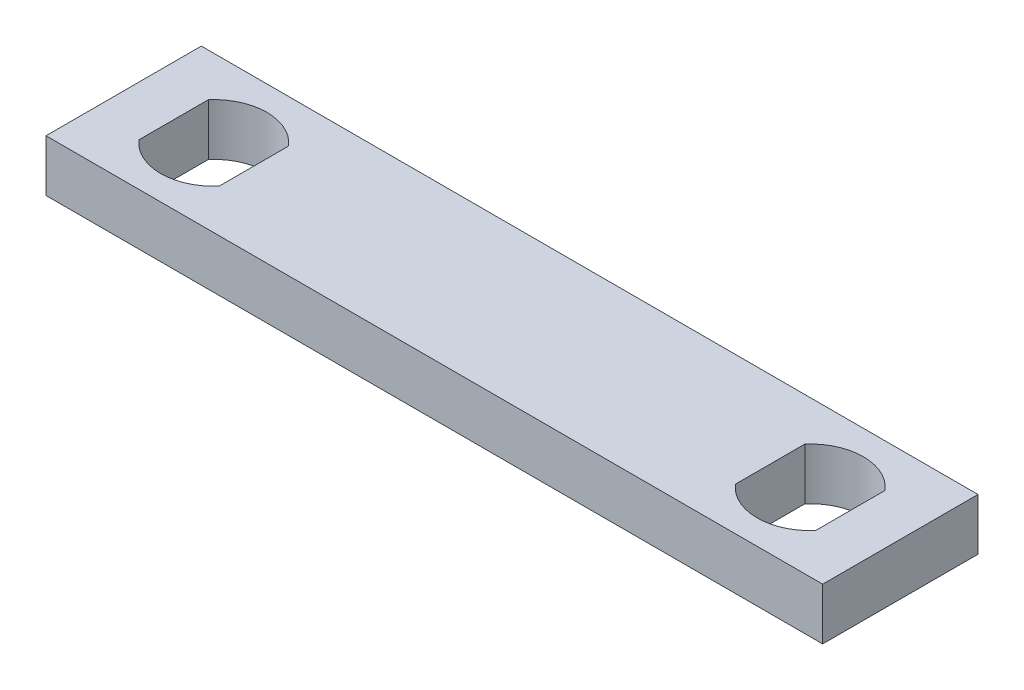
ISO-10303-21;
HEADER;
FILE_DESCRIPTION(('STEP AP214'),'2;1');
FILE_NAME('part.step','',(''),(''),'','','');
FILE_SCHEMA(('AUTOMOTIVE_DESIGN { 1 0 10303 214 1 1 1 1 }'));
ENDSEC;
DATA;
#1=APPLICATION_CONTEXT('core data for automotive mechanical design processes');
#2=APPLICATION_PROTOCOL_DEFINITION('international standard','automotive_design',2000,#1);
#3=PRODUCT_CONTEXT('',#1,'mechanical');
#4=PRODUCT('Part','Part','',(#3));
#5=PRODUCT_RELATED_PRODUCT_CATEGORY('part','',(#4));
#6=PRODUCT_DEFINITION_FORMATION('','',#4);
#7=PRODUCT_DEFINITION_CONTEXT('part definition',#1,'design');
#8=PRODUCT_DEFINITION('design','',#6,#7);
#9=PRODUCT_DEFINITION_SHAPE('','',#8);
#10=(LENGTH_UNIT() NAMED_UNIT(*) SI_UNIT(.MILLI.,.METRE.));
#11=(NAMED_UNIT(*) PLANE_ANGLE_UNIT() SI_UNIT($,.RADIAN.));
#12=(NAMED_UNIT(*) SI_UNIT($,.STERADIAN.) SOLID_ANGLE_UNIT());
#13=UNCERTAINTY_MEASURE_WITH_UNIT(LENGTH_MEASURE(1.E-05),#10,'distance_accuracy_value','');
#14=(GEOMETRIC_REPRESENTATION_CONTEXT(3) GLOBAL_UNCERTAINTY_ASSIGNED_CONTEXT((#13)) GLOBAL_UNIT_ASSIGNED_CONTEXT((#10,
#11,#12)) REPRESENTATION_CONTEXT('',''));
#15=CARTESIAN_POINT('',(0.,0.,0.));
#16=DIRECTION('',(0.,0.,1.));
#17=DIRECTION('',(1.,0.,0.));
#18=AXIS2_PLACEMENT_3D('',#15,#16,#17);
#19=CARTESIAN_POINT('',(0.,5.,0.));
#20=DIRECTION('',(0.,1.,0.));
#21=DIRECTION('',(0.,0.,1.));
#22=AXIS2_PLACEMENT_3D('',#19,#20,#21);
#23=PLANE('',#22);
#24=CARTESIAN_POINT('',(-57.6,5.,0.));
#25=DIRECTION('',(0.,1.,0.));
#26=DIRECTION('',(0.,0.,1.));
#27=AXIS2_PLACEMENT_3D('',#24,#25,#26);
#28=CIRCLE('',#27,10.25);
#29=CARTESIAN_POINT('',(-49.85,5.,-6.70820393249937));
#30=VERTEX_POINT('',#29);
#31=CARTESIAN_POINT('',(-65.35,5.,-6.70820393249937));
#32=VERTEX_POINT('',#31);
#33=EDGE_CURVE('E170',#30,#32,#28,.T.);
#34=ORIENTED_EDGE('',*,*,#33,.F.);
#35=DIRECTION('',(0.,0.,-1.));
#36=VECTOR('',#35,1.);
#37=CARTESIAN_POINT('',(-49.85,5.,-6.70820393249937));
#38=LINE('',#37,#36);
#39=CARTESIAN_POINT('',(-49.85,5.,6.70820393249936));
#40=VERTEX_POINT('',#39);
#41=EDGE_CURVE('E181',#40,#30,#38,.T.);
#42=ORIENTED_EDGE('',*,*,#41,.F.);
#43=CARTESIAN_POINT('',(-57.6,5.,0.));
#44=DIRECTION('',(0.,1.,0.));
#45=DIRECTION('',(0.,0.,1.));
#46=AXIS2_PLACEMENT_3D('',#43,#44,#45);
#47=CIRCLE('',#46,10.25);
#48=CARTESIAN_POINT('',(-65.35,5.,6.70820393249937));
#49=VERTEX_POINT('',#48);
#50=EDGE_CURVE('E200',#49,#40,#47,.T.);
#51=ORIENTED_EDGE('',*,*,#50,.F.);
#52=DIRECTION('',(0.,0.,1.));
#53=VECTOR('',#52,1.);
#54=CARTESIAN_POINT('',(-65.35,5.,-6.70820393249937));
#55=LINE('',#54,#53);
#56=EDGE_CURVE('E196',#32,#49,#55,.T.);
#57=ORIENTED_EDGE('',*,*,#56,.F.);
#58=EDGE_LOOP('',(#34,#42,#51,#57));
#59=FACE_BOUND('',#58,.T.);
#60=DIRECTION('',(0.,0.,-1.));
#61=VECTOR('',#60,1.);
#62=CARTESIAN_POINT('',(75.,5.,-15.));
#63=LINE('',#62,#61);
#64=CARTESIAN_POINT('',(75.,5.,15.));
#65=VERTEX_POINT('',#64);
#66=CARTESIAN_POINT('',(75.,5.,-15.));
#67=VERTEX_POINT('',#66);
#68=EDGE_CURVE('E220',#65,#67,#63,.T.);
#69=ORIENTED_EDGE('',*,*,#68,.T.);
#70=DIRECTION('',(-1.,0.,0.));
#71=VECTOR('',#70,1.);
#72=CARTESIAN_POINT('',(-75.,5.,-15.));
#73=LINE('',#72,#71);
#74=CARTESIAN_POINT('',(-75.,5.,-15.));
#75=VERTEX_POINT('',#74);
#76=EDGE_CURVE('E224',#67,#75,#73,.T.);
#77=ORIENTED_EDGE('',*,*,#76,.T.);
#78=DIRECTION('',(0.,0.,1.));
#79=VECTOR('',#78,1.);
#80=CARTESIAN_POINT('',(-75.,5.,-15.));
#81=LINE('',#80,#79);
#82=CARTESIAN_POINT('',(-75.,5.,15.));
#83=VERTEX_POINT('',#82);
#84=EDGE_CURVE('E228',#75,#83,#81,.T.);
#85=ORIENTED_EDGE('',*,*,#84,.T.);
#86=DIRECTION('',(1.,0.,0.));
#87=VECTOR('',#86,1.);
#88=CARTESIAN_POINT('',(-75.,5.,15.));
#89=LINE('',#88,#87);
#90=EDGE_CURVE('E231',#83,#65,#89,.T.);
#91=ORIENTED_EDGE('',*,*,#90,.T.);
#92=EDGE_LOOP('',(#69,#77,#85,#91));
#93=FACE_BOUND('',#92,.T.);
#94=DIRECTION('',(0.,0.,-1.));
#95=VECTOR('',#94,1.);
#96=CARTESIAN_POINT('',(49.85,5.,-6.70820393249937));
#97=LINE('',#96,#95);
#98=CARTESIAN_POINT('',(49.85,5.,6.70820393249936));
#99=VERTEX_POINT('',#98);
#100=CARTESIAN_POINT('',(49.85,5.,-6.70820393249937));
#101=VERTEX_POINT('',#100);
#102=EDGE_CURVE('E161',#99,#101,#97,.T.);
#103=ORIENTED_EDGE('',*,*,#102,.T.);
#104=CARTESIAN_POINT('',(57.6,5.,0.));
#105=DIRECTION('',(0.,-1.,0.));
#106=DIRECTION('',(0.,0.,1.));
#107=AXIS2_PLACEMENT_3D('',#104,#105,#106);
#108=CIRCLE('',#107,10.25);
#109=CARTESIAN_POINT('',(65.35,5.,-6.70820393249937));
#110=VERTEX_POINT('',#109);
#111=EDGE_CURVE('E55',#101,#110,#108,.T.);
#112=ORIENTED_EDGE('',*,*,#111,.T.);
#113=DIRECTION('',(0.,0.,1.));
#114=VECTOR('',#113,1.);
#115=CARTESIAN_POINT('',(65.35,5.,-6.70820393249937));
#116=LINE('',#115,#114);
#117=CARTESIAN_POINT('',(65.35,5.,6.70820393249937));
#118=VERTEX_POINT('',#117);
#119=EDGE_CURVE('E148',#110,#118,#116,.T.);
#120=ORIENTED_EDGE('',*,*,#119,.T.);
#121=CARTESIAN_POINT('',(57.6,5.,0.));
#122=DIRECTION('',(0.,-1.,0.));
#123=DIRECTION('',(0.,0.,1.));
#124=AXIS2_PLACEMENT_3D('',#121,#122,#123);
#125=CIRCLE('',#124,10.25);
#126=EDGE_CURVE('E152',#118,#99,#125,.T.);
#127=ORIENTED_EDGE('',*,*,#126,.T.);
#128=EDGE_LOOP('',(#103,#112,#120,#127));
#129=FACE_BOUND('',#128,.T.);
#130=ADVANCED_FACE('F39',(#59,#93,#129),#23,.T.);
#131=CARTESIAN_POINT('',(0.,-5.,0.));
#132=DIRECTION('',(0.,1.,0.));
#133=DIRECTION('',(0.,0.,1.));
#134=AXIS2_PLACEMENT_3D('',#131,#132,#133);
#135=PLANE('',#134);
#136=DIRECTION('',(0.,0.,-1.));
#137=VECTOR('',#136,1.);
#138=CARTESIAN_POINT('',(75.,-5.,-15.));
#139=LINE('',#138,#137);
#140=CARTESIAN_POINT('',(75.,-5.,15.));
#141=VERTEX_POINT('',#140);
#142=CARTESIAN_POINT('',(75.,-5.,-15.));
#143=VERTEX_POINT('',#142);
#144=EDGE_CURVE('E210',#141,#143,#139,.T.);
#145=ORIENTED_EDGE('',*,*,#144,.F.);
#146=DIRECTION('',(1.,0.,0.));
#147=VECTOR('',#146,1.);
#148=CARTESIAN_POINT('',(-75.,-5.,15.));
#149=LINE('',#148,#147);
#150=CARTESIAN_POINT('',(-75.,-5.,15.));
#151=VERTEX_POINT('',#150);
#152=EDGE_CURVE('E225',#151,#141,#149,.T.);
#153=ORIENTED_EDGE('',*,*,#152,.F.);
#154=DIRECTION('',(0.,0.,1.));
#155=VECTOR('',#154,1.);
#156=CARTESIAN_POINT('',(-75.,-5.,-15.));
#157=LINE('',#156,#155);
#158=CARTESIAN_POINT('',(-75.,-5.,-15.));
#159=VERTEX_POINT('',#158);
#160=EDGE_CURVE('E241',#159,#151,#157,.T.);
#161=ORIENTED_EDGE('',*,*,#160,.F.);
#162=DIRECTION('',(-1.,0.,0.));
#163=VECTOR('',#162,1.);
#164=CARTESIAN_POINT('',(-75.,-5.,-15.));
#165=LINE('',#164,#163);
#166=EDGE_CURVE('E238',#143,#159,#165,.T.);
#167=ORIENTED_EDGE('',*,*,#166,.F.);
#168=EDGE_LOOP('',(#145,#153,#161,#167));
#169=FACE_BOUND('',#168,.T.);
#170=DIRECTION('',(0.,0.,-1.));
#171=VECTOR('',#170,1.);
#172=CARTESIAN_POINT('',(-49.85,-5.,-6.70820393249937));
#173=LINE('',#172,#171);
#174=CARTESIAN_POINT('',(-49.85,-5.,6.70820393249936));
#175=VERTEX_POINT('',#174);
#176=CARTESIAN_POINT('',(-49.85,-5.,-6.70820393249937));
#177=VERTEX_POINT('',#176);
#178=EDGE_CURVE('E189',#175,#177,#173,.T.);
#179=ORIENTED_EDGE('',*,*,#178,.T.);
#180=CARTESIAN_POINT('',(-57.6,-5.,0.));
#181=DIRECTION('',(0.,1.,0.));
#182=DIRECTION('',(0.,0.,1.));
#183=AXIS2_PLACEMENT_3D('',#180,#181,#182);
#184=CIRCLE('',#183,10.25);
#185=CARTESIAN_POINT('',(-65.35,-5.,-6.70820393249937));
#186=VERTEX_POINT('',#185);
#187=EDGE_CURVE('E176',#177,#186,#184,.T.);
#188=ORIENTED_EDGE('',*,*,#187,.T.);
#189=DIRECTION('',(0.,0.,1.));
#190=VECTOR('',#189,1.);
#191=CARTESIAN_POINT('',(-65.35,-5.,-6.70820393249937));
#192=LINE('',#191,#190);
#193=CARTESIAN_POINT('',(-65.35,-5.,6.70820393249937));
#194=VERTEX_POINT('',#193);
#195=EDGE_CURVE('E180',#186,#194,#192,.T.);
#196=ORIENTED_EDGE('',*,*,#195,.T.);
#197=CARTESIAN_POINT('',(-57.6,-5.,0.));
#198=DIRECTION('',(0.,1.,0.));
#199=DIRECTION('',(0.,0.,1.));
#200=AXIS2_PLACEMENT_3D('',#197,#198,#199);
#201=CIRCLE('',#200,10.25);
#202=EDGE_CURVE('E185',#194,#175,#201,.T.);
#203=ORIENTED_EDGE('',*,*,#202,.T.);
#204=EDGE_LOOP('',(#179,#188,#196,#203));
#205=FACE_BOUND('',#204,.T.);
#206=CARTESIAN_POINT('',(57.6,-5.,0.));
#207=DIRECTION('',(0.,-1.,0.));
#208=DIRECTION('',(0.,0.,1.));
#209=AXIS2_PLACEMENT_3D('',#206,#207,#208);
#210=CIRCLE('',#209,10.25);
#211=CARTESIAN_POINT('',(49.85,-5.,-6.70820393249937));
#212=VERTEX_POINT('',#211);
#213=CARTESIAN_POINT('',(65.35,-5.,-6.70820393249937));
#214=VERTEX_POINT('',#213);
#215=EDGE_CURVE('E138',#212,#214,#210,.T.);
#216=ORIENTED_EDGE('',*,*,#215,.F.);
#217=DIRECTION('',(0.,0.,-1.));
#218=VECTOR('',#217,1.);
#219=CARTESIAN_POINT('',(49.85,-5.,-6.70820393249937));
#220=LINE('',#219,#218);
#221=CARTESIAN_POINT('',(49.85,-5.,6.70820393249936));
#222=VERTEX_POINT('',#221);
#223=EDGE_CURVE('E129',#222,#212,#220,.T.);
#224=ORIENTED_EDGE('',*,*,#223,.F.);
#225=CARTESIAN_POINT('',(57.6,-5.,0.));
#226=DIRECTION('',(0.,-1.,0.));
#227=DIRECTION('',(0.,0.,1.));
#228=AXIS2_PLACEMENT_3D('',#225,#226,#227);
#229=CIRCLE('',#228,10.25);
#230=CARTESIAN_POINT('',(65.35,-5.,6.70820393249937));
#231=VERTEX_POINT('',#230);
#232=EDGE_CURVE('E137',#231,#222,#229,.T.);
#233=ORIENTED_EDGE('',*,*,#232,.F.);
#234=DIRECTION('',(0.,0.,1.));
#235=VECTOR('',#234,1.);
#236=CARTESIAN_POINT('',(65.35,-5.,-6.70820393249937));
#237=LINE('',#236,#235);
#238=EDGE_CURVE('E143',#214,#231,#237,.T.);
#239=ORIENTED_EDGE('',*,*,#238,.F.);
#240=EDGE_LOOP('',(#216,#224,#233,#239));
#241=FACE_BOUND('',#240,.T.);
#242=ADVANCED_FACE('F146',(#169,#205,#241),#135,.F.);
#243=CARTESIAN_POINT('',(75.,5.,-15.));
#244=DIRECTION('',(-1.,0.,0.));
#245=DIRECTION('',(0.,0.,1.));
#246=AXIS2_PLACEMENT_3D('',#243,#244,#245);
#247=PLANE('',#246);
#248=ORIENTED_EDGE('',*,*,#144,.T.);
#249=DIRECTION('',(0.,-1.,0.));
#250=VECTOR('',#249,1.);
#251=CARTESIAN_POINT('',(75.,5.,-15.));
#252=LINE('',#251,#250);
#253=EDGE_CURVE('E11',#67,#143,#252,.T.);
#254=ORIENTED_EDGE('',*,*,#253,.F.);
#255=ORIENTED_EDGE('',*,*,#68,.F.);
#256=DIRECTION('',(0.,-1.,0.));
#257=VECTOR('',#256,1.);
#258=CARTESIAN_POINT('',(75.,5.,15.));
#259=LINE('',#258,#257);
#260=EDGE_CURVE('E234',#65,#141,#259,.T.);
#261=ORIENTED_EDGE('',*,*,#260,.T.);
#262=EDGE_LOOP('',(#248,#254,#255,#261));
#263=FACE_BOUND('',#262,.T.);
#264=ADVANCED_FACE('F41',(#263),#247,.F.);
#265=CARTESIAN_POINT('',(-75.,5.,-15.));
#266=DIRECTION('',(0.,0.,1.));
#267=DIRECTION('',(1.,0.,0.));
#268=AXIS2_PLACEMENT_3D('',#265,#266,#267);
#269=PLANE('',#268);
#270=ORIENTED_EDGE('',*,*,#166,.T.);
#271=DIRECTION('',(0.,-1.,0.));
#272=VECTOR('',#271,1.);
#273=CARTESIAN_POINT('',(-75.,5.,-15.));
#274=LINE('',#273,#272);
#275=EDGE_CURVE('E48',#75,#159,#274,.T.);
#276=ORIENTED_EDGE('',*,*,#275,.F.);
#277=ORIENTED_EDGE('',*,*,#76,.F.);
#278=ORIENTED_EDGE('',*,*,#253,.T.);
#279=EDGE_LOOP('',(#270,#276,#277,#278));
#280=FACE_BOUND('',#279,.T.);
#281=ADVANCED_FACE('F274',(#280),#269,.F.);
#282=CARTESIAN_POINT('',(-75.,5.,-15.));
#283=DIRECTION('',(1.,0.,0.));
#284=DIRECTION('',(0.,0.,-1.));
#285=AXIS2_PLACEMENT_3D('',#282,#283,#284);
#286=PLANE('',#285);
#287=ORIENTED_EDGE('',*,*,#160,.T.);
#288=DIRECTION('',(0.,-1.,0.));
#289=VECTOR('',#288,1.);
#290=CARTESIAN_POINT('',(-75.,5.,15.));
#291=LINE('',#290,#289);
#292=EDGE_CURVE('E249',#83,#151,#291,.T.);
#293=ORIENTED_EDGE('',*,*,#292,.F.);
#294=ORIENTED_EDGE('',*,*,#84,.F.);
#295=ORIENTED_EDGE('',*,*,#275,.T.);
#296=EDGE_LOOP('',(#287,#293,#294,#295));
#297=FACE_BOUND('',#296,.T.);
#298=ADVANCED_FACE('F258',(#297),#286,.F.);
#299=CARTESIAN_POINT('',(-75.,5.,15.));
#300=DIRECTION('',(0.,0.,-1.));
#301=DIRECTION('',(-1.,0.,0.));
#302=AXIS2_PLACEMENT_3D('',#299,#300,#301);
#303=PLANE('',#302);
#304=ORIENTED_EDGE('',*,*,#152,.T.);
#305=ORIENTED_EDGE('',*,*,#260,.F.);
#306=ORIENTED_EDGE('',*,*,#90,.F.);
#307=ORIENTED_EDGE('',*,*,#292,.T.);
#308=EDGE_LOOP('',(#304,#305,#306,#307));
#309=FACE_BOUND('',#308,.T.);
#310=ADVANCED_FACE('F267',(#309),#303,.F.);
#311=CARTESIAN_POINT('',(-57.6,-5.,0.));
#312=DIRECTION('',(0.,1.,0.));
#313=DIRECTION('',(0.,0.,1.));
#314=AXIS2_PLACEMENT_3D('',#311,#312,#313);
#315=CYLINDRICAL_SURFACE('',#314,10.25);
#316=ORIENTED_EDGE('',*,*,#33,.T.);
#317=DIRECTION('',(0.,1.,0.));
#318=VECTOR('',#317,1.);
#319=CARTESIAN_POINT('',(-65.35,-5.,-6.70820393249937));
#320=LINE('',#319,#318);
#321=EDGE_CURVE('E193',#186,#32,#320,.T.);
#322=ORIENTED_EDGE('',*,*,#321,.F.);
#323=ORIENTED_EDGE('',*,*,#187,.F.);
#324=DIRECTION('',(0.,1.,0.));
#325=VECTOR('',#324,1.);
#326=CARTESIAN_POINT('',(-49.85,-5.,-6.70820393249937));
#327=LINE('',#326,#325);
#328=EDGE_CURVE('E207',#177,#30,#327,.T.);
#329=ORIENTED_EDGE('',*,*,#328,.T.);
#330=EDGE_LOOP('',(#316,#322,#323,#329));
#331=FACE_BOUND('',#330,.T.);
#332=ADVANCED_FACE('F290',(#331),#315,.F.);
#333=CARTESIAN_POINT('',(-49.85,-5.,-6.70820393249937));
#334=DIRECTION('',(1.,0.,0.));
#335=DIRECTION('',(0.,0.,-1.));
#336=AXIS2_PLACEMENT_3D('',#333,#334,#335);
#337=PLANE('',#336);
#338=ORIENTED_EDGE('',*,*,#41,.T.);
#339=ORIENTED_EDGE('',*,*,#328,.F.);
#340=ORIENTED_EDGE('',*,*,#178,.F.);
#341=DIRECTION('',(0.,1.,0.));
#342=VECTOR('',#341,1.);
#343=CARTESIAN_POINT('',(-49.85,-5.,6.70820393249936));
#344=LINE('',#343,#342);
#345=EDGE_CURVE('E211',#175,#40,#344,.T.);
#346=ORIENTED_EDGE('',*,*,#345,.T.);
#347=EDGE_LOOP('',(#338,#339,#340,#346));
#348=FACE_BOUND('',#347,.T.);
#349=ADVANCED_FACE('F297',(#348),#337,.F.);
#350=CARTESIAN_POINT('',(-57.6,-5.,0.));
#351=DIRECTION('',(0.,1.,0.));
#352=DIRECTION('',(0.,0.,1.));
#353=AXIS2_PLACEMENT_3D('',#350,#351,#352);
#354=CYLINDRICAL_SURFACE('',#353,10.25);
#355=ORIENTED_EDGE('',*,*,#50,.T.);
#356=ORIENTED_EDGE('',*,*,#345,.F.);
#357=ORIENTED_EDGE('',*,*,#202,.F.);
#358=DIRECTION('',(0.,1.,0.));
#359=VECTOR('',#358,1.);
#360=CARTESIAN_POINT('',(-65.35,-5.,6.70820393249937));
#361=LINE('',#360,#359);
#362=EDGE_CURVE('E214',#194,#49,#361,.T.);
#363=ORIENTED_EDGE('',*,*,#362,.T.);
#364=EDGE_LOOP('',(#355,#356,#357,#363));
#365=FACE_BOUND('',#364,.T.);
#366=ADVANCED_FACE('F302',(#365),#354,.F.);
#367=CARTESIAN_POINT('',(-65.35,-5.,-6.70820393249937));
#368=DIRECTION('',(-1.,0.,0.));
#369=DIRECTION('',(0.,0.,1.));
#370=AXIS2_PLACEMENT_3D('',#367,#368,#369);
#371=PLANE('',#370);
#372=ORIENTED_EDGE('',*,*,#56,.T.);
#373=ORIENTED_EDGE('',*,*,#362,.F.);
#374=ORIENTED_EDGE('',*,*,#195,.F.);
#375=ORIENTED_EDGE('',*,*,#321,.T.);
#376=EDGE_LOOP('',(#372,#373,#374,#375));
#377=FACE_BOUND('',#376,.T.);
#378=ADVANCED_FACE('F310',(#377),#371,.F.);
#379=CARTESIAN_POINT('',(57.6,-5.,0.));
#380=DIRECTION('',(0.,1.,0.));
#381=DIRECTION('',(0.,0.,1.));
#382=AXIS2_PLACEMENT_3D('',#379,#380,#381);
#383=CYLINDRICAL_SURFACE('',#382,10.25);
#384=ORIENTED_EDGE('',*,*,#111,.F.);
#385=DIRECTION('',(0.,1.,0.));
#386=VECTOR('',#385,1.);
#387=CARTESIAN_POINT('',(49.85,-5.,-6.70820393249937));
#388=LINE('',#387,#386);
#389=EDGE_CURVE('E131',#212,#101,#388,.T.);
#390=ORIENTED_EDGE('',*,*,#389,.F.);
#391=ORIENTED_EDGE('',*,*,#215,.T.);
#392=DIRECTION('',(0.,1.,0.));
#393=VECTOR('',#392,1.);
#394=CARTESIAN_POINT('',(65.35,-5.,-6.70820393249937));
#395=LINE('',#394,#393);
#396=EDGE_CURVE('E167',#214,#110,#395,.T.);
#397=ORIENTED_EDGE('',*,*,#396,.T.);
#398=EDGE_LOOP('',(#384,#390,#391,#397));
#399=FACE_BOUND('',#398,.T.);
#400=ADVANCED_FACE('F140',(#399),#383,.F.);
#401=CARTESIAN_POINT('',(65.35,-5.,-6.70820393249937));
#402=DIRECTION('',(-1.,0.,0.));
#403=DIRECTION('',(0.,0.,1.));
#404=AXIS2_PLACEMENT_3D('',#401,#402,#403);
#405=PLANE('',#404);
#406=ORIENTED_EDGE('',*,*,#119,.F.);
#407=ORIENTED_EDGE('',*,*,#396,.F.);
#408=ORIENTED_EDGE('',*,*,#238,.T.);
#409=DIRECTION('',(0.,1.,0.));
#410=VECTOR('',#409,1.);
#411=CARTESIAN_POINT('',(65.35,-5.,6.70820393249937));
#412=LINE('',#411,#410);
#413=EDGE_CURVE('E171',#231,#118,#412,.T.);
#414=ORIENTED_EDGE('',*,*,#413,.T.);
#415=EDGE_LOOP('',(#406,#407,#408,#414));
#416=FACE_BOUND('',#415,.T.);
#417=ADVANCED_FACE('F323',(#416),#405,.T.);
#418=CARTESIAN_POINT('',(57.6,-5.,0.));
#419=DIRECTION('',(0.,1.,0.));
#420=DIRECTION('',(0.,0.,1.));
#421=AXIS2_PLACEMENT_3D('',#418,#419,#420);
#422=CYLINDRICAL_SURFACE('',#421,10.25);
#423=ORIENTED_EDGE('',*,*,#126,.F.);
#424=ORIENTED_EDGE('',*,*,#413,.F.);
#425=ORIENTED_EDGE('',*,*,#232,.T.);
#426=DIRECTION('',(0.,1.,0.));
#427=VECTOR('',#426,1.);
#428=CARTESIAN_POINT('',(49.85,-5.,6.70820393249936));
#429=LINE('',#428,#427);
#430=EDGE_CURVE('E63',#222,#99,#429,.T.);
#431=ORIENTED_EDGE('',*,*,#430,.T.);
#432=EDGE_LOOP('',(#423,#424,#425,#431));
#433=FACE_BOUND('',#432,.T.);
#434=ADVANCED_FACE('F326',(#433),#422,.F.);
#435=CARTESIAN_POINT('',(49.85,-5.,-6.70820393249937));
#436=DIRECTION('',(1.,0.,0.));
#437=DIRECTION('',(0.,0.,-1.));
#438=AXIS2_PLACEMENT_3D('',#435,#436,#437);
#439=PLANE('',#438);
#440=ORIENTED_EDGE('',*,*,#102,.F.);
#441=ORIENTED_EDGE('',*,*,#430,.F.);
#442=ORIENTED_EDGE('',*,*,#223,.T.);
#443=ORIENTED_EDGE('',*,*,#389,.T.);
#444=EDGE_LOOP('',(#440,#441,#442,#443));
#445=FACE_BOUND('',#444,.T.);
#446=ADVANCED_FACE('F130',(#445),#439,.T.);
#447=CLOSED_SHELL('',(#130,#242,#264,#281,#298,#310,#332,#349,#366,#378,#400,#417,#434,#446));
#448=MANIFOLD_SOLID_BREP('B2',#447);
#449=ADVANCED_BREP_SHAPE_REPRESENTATION('',(#18,#448),#14);
#450=SHAPE_DEFINITION_REPRESENTATION(#9,#449);
ENDSEC;
END-ISO-10303-21;
